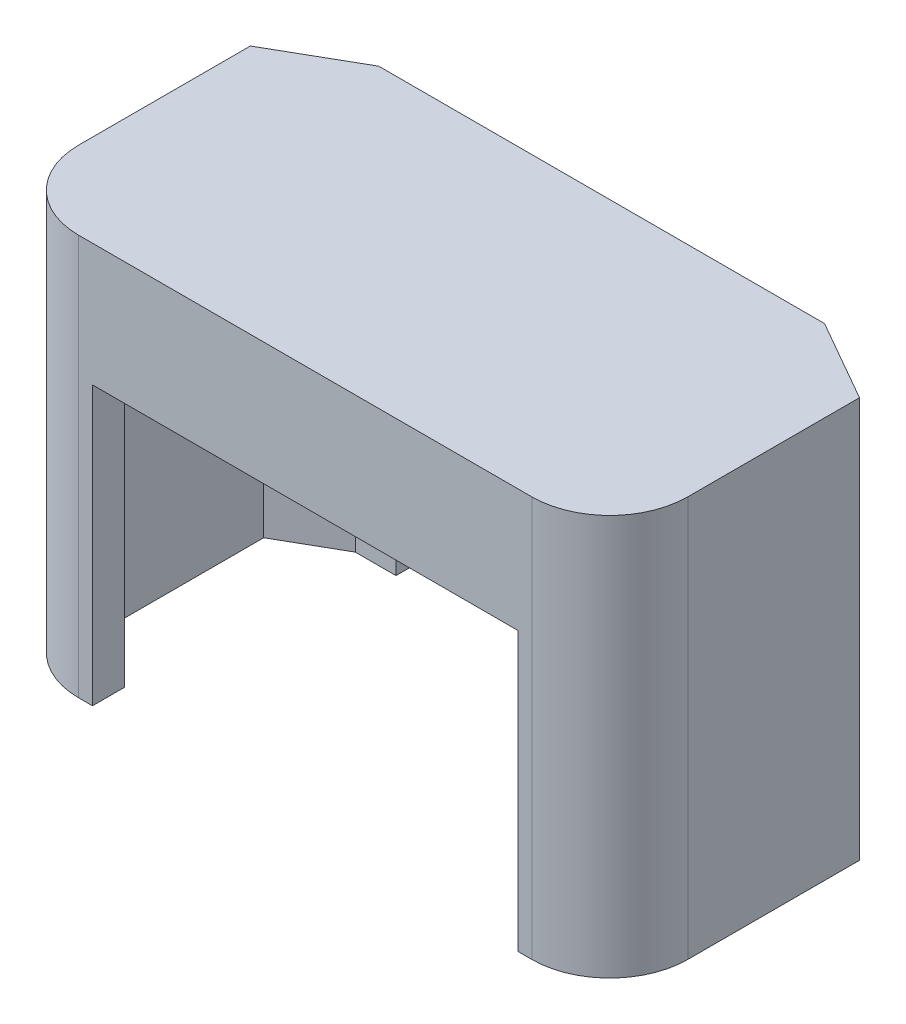
ISO-10303-21;
HEADER;
FILE_DESCRIPTION(('STEP AP214'),'2;1');
FILE_NAME('part.step','',(''),(''),'','','');
FILE_SCHEMA(('AUTOMOTIVE_DESIGN { 1 0 10303 214 1 1 1 1 }'));
ENDSEC;
DATA;
#1=APPLICATION_CONTEXT('core data for automotive mechanical design processes');
#2=APPLICATION_PROTOCOL_DEFINITION('international standard','automotive_design',2000,#1);
#3=PRODUCT_CONTEXT('',#1,'mechanical');
#4=PRODUCT('Part','Part','',(#3));
#5=PRODUCT_RELATED_PRODUCT_CATEGORY('part','',(#4));
#6=PRODUCT_DEFINITION_FORMATION('','',#4);
#7=PRODUCT_DEFINITION_CONTEXT('part definition',#1,'design');
#8=PRODUCT_DEFINITION('design','',#6,#7);
#9=PRODUCT_DEFINITION_SHAPE('','',#8);
#10=(LENGTH_UNIT() NAMED_UNIT(*) SI_UNIT(.MILLI.,.METRE.));
#11=(NAMED_UNIT(*) PLANE_ANGLE_UNIT() SI_UNIT($,.RADIAN.));
#12=(NAMED_UNIT(*) SI_UNIT($,.STERADIAN.) SOLID_ANGLE_UNIT());
#13=UNCERTAINTY_MEASURE_WITH_UNIT(LENGTH_MEASURE(1.E-05),#10,'distance_accuracy_value','');
#14=(GEOMETRIC_REPRESENTATION_CONTEXT(3) GLOBAL_UNCERTAINTY_ASSIGNED_CONTEXT((#13)) GLOBAL_UNIT_ASSIGNED_CONTEXT((#10,
#11,#12)) REPRESENTATION_CONTEXT('',''));
#15=CARTESIAN_POINT('',(0.,0.,0.));
#16=DIRECTION('',(0.,0.,1.));
#17=DIRECTION('',(1.,0.,0.));
#18=AXIS2_PLACEMENT_3D('',#15,#16,#17);
#19=CARTESIAN_POINT('',(-31.95,0.,9.9));
#20=DIRECTION('',(0.,-1.,0.));
#21=DIRECTION('',(0.,0.,-1.));
#22=AXIS2_PLACEMENT_3D('',#19,#20,#21);
#23=PLANE('',#22);
#24=DIRECTION('',(-1.,0.,0.));
#25=VECTOR('',#24,1.);
#26=CARTESIAN_POINT('',(-30.24,0.,-16.4));
#27=LINE('',#26,#25);
#28=CARTESIAN_POINT('',(30.24,0.,-16.4));
#29=VERTEX_POINT('',#28);
#30=CARTESIAN_POINT('',(24.5,0.,-16.4));
#31=VERTEX_POINT('',#30);
#32=EDGE_CURVE('E222',#29,#31,#27,.T.);
#33=ORIENTED_EDGE('',*,*,#32,.T.);
#34=DIRECTION('',(0.,0.,-1.));
#35=VECTOR('',#34,1.);
#36=CARTESIAN_POINT('',(24.5,0.,20.901));
#37=LINE('',#36,#35);
#38=CARTESIAN_POINT('',(24.5,0.,-20.9));
#39=VERTEX_POINT('',#38);
#40=EDGE_CURVE('E201',#31,#39,#37,.T.);
#41=ORIENTED_EDGE('',*,*,#40,.T.);
#42=DIRECTION('',(-1.,0.,0.));
#43=VECTOR('',#42,1.);
#44=CARTESIAN_POINT('',(-31.4369350222823,0.,-20.9));
#45=LINE('',#44,#43);
#46=CARTESIAN_POINT('',(31.4369350222823,0.,-20.9));
#47=VERTEX_POINT('',#46);
#48=EDGE_CURVE('E273',#47,#39,#45,.T.);
#49=ORIENTED_EDGE('',*,*,#48,.F.);
#50=DIRECTION('',(-0.867852571547069,0.,-0.496821813187725));
#51=VECTOR('',#50,1.);
#52=CARTESIAN_POINT('',(31.4369350222823,0.,-20.9));
#53=LINE('',#52,#51);
#54=CARTESIAN_POINT('',(42.95,0.,-14.3090858227438));
#55=VERTEX_POINT('',#54);
#56=EDGE_CURVE('E271',#55,#47,#53,.T.);
#57=ORIENTED_EDGE('',*,*,#56,.F.);
#58=DIRECTION('',(0.,0.,-1.));
#59=VECTOR('',#58,1.);
#60=CARTESIAN_POINT('',(42.95,0.,9.89999999999996));
#61=LINE('',#60,#59);
#62=CARTESIAN_POINT('',(42.95,0.,9.89999999999996));
#63=VERTEX_POINT('',#62);
#64=EDGE_CURVE('E267',#63,#55,#61,.T.);
#65=ORIENTED_EDGE('',*,*,#64,.F.);
#66=CARTESIAN_POINT('',(31.95,0.,9.9));
#67=DIRECTION('',(0.,1.,0.));
#68=DIRECTION('',(0.,0.,1.));
#69=AXIS2_PLACEMENT_3D('',#66,#67,#68);
#70=CIRCLE('',#69,11.);
#71=CARTESIAN_POINT('',(31.9499999999999,0.,20.9));
#72=VERTEX_POINT('',#71);
#73=EDGE_CURVE('E270',#72,#63,#70,.T.);
#74=ORIENTED_EDGE('',*,*,#73,.F.);
#75=DIRECTION('',(1.,0.,0.));
#76=VECTOR('',#75,1.);
#77=CARTESIAN_POINT('',(-31.95,0.,20.9));
#78=LINE('',#77,#76);
#79=CARTESIAN_POINT('',(30.,0.,20.9));
#80=VERTEX_POINT('',#79);
#81=EDGE_CURVE('E263',#80,#72,#78,.T.);
#82=ORIENTED_EDGE('',*,*,#81,.F.);
#83=DIRECTION('',(0.,0.,1.));
#84=VECTOR('',#83,1.);
#85=CARTESIAN_POINT('',(30.,0.,-20.901));
#86=LINE('',#85,#84);
#87=CARTESIAN_POINT('',(30.,0.,16.4));
#88=VERTEX_POINT('',#87);
#89=EDGE_CURVE('E424',#88,#80,#86,.T.);
#90=ORIENTED_EDGE('',*,*,#89,.F.);
#91=DIRECTION('',(1.,0.,0.));
#92=VECTOR('',#91,1.);
#93=CARTESIAN_POINT('',(-31.95,0.,16.4));
#94=LINE('',#93,#92);
#95=CARTESIAN_POINT('',(31.95,0.,16.4));
#96=VERTEX_POINT('',#95);
#97=EDGE_CURVE('E365',#88,#96,#94,.T.);
#98=ORIENTED_EDGE('',*,*,#97,.T.);
#99=CARTESIAN_POINT('',(31.95,0.,9.9));
#100=DIRECTION('',(0.,1.,0.));
#101=DIRECTION('',(0.,0.,1.));
#102=AXIS2_PLACEMENT_3D('',#99,#100,#101);
#103=CIRCLE('',#102,6.5);
#104=CARTESIAN_POINT('',(38.45,0.,9.89999999999996));
#105=VERTEX_POINT('',#104);
#106=EDGE_CURVE('E366',#96,#105,#103,.T.);
#107=ORIENTED_EDGE('',*,*,#106,.T.);
#108=DIRECTION('',(0.,0.,-1.));
#109=VECTOR('',#108,1.);
#110=CARTESIAN_POINT('',(38.45,0.,9.89999999999996));
#111=LINE('',#110,#109);
#112=CARTESIAN_POINT('',(38.45,0.,-11.7));
#113=VERTEX_POINT('',#112);
#114=EDGE_CURVE('E367',#105,#113,#111,.T.);
#115=ORIENTED_EDGE('',*,*,#114,.T.);
#116=DIRECTION('',(-0.867852571547069,0.,-0.496821813187725));
#117=VECTOR('',#116,1.);
#118=CARTESIAN_POINT('',(30.24,0.,-16.4));
#119=LINE('',#118,#117);
#120=EDGE_CURVE('E226',#113,#29,#119,.T.);
#121=ORIENTED_EDGE('',*,*,#120,.T.);
#122=EDGE_LOOP('',(#33,#41,#49,#57,#65,#74,#82,#90,#98,#107,#115,#121));
#123=FACE_BOUND('',#122,.T.);
#124=ADVANCED_FACE('F43',(#123),#23,.T.);
#125=CARTESIAN_POINT('',(-31.4369350222823,52.,-20.9));
#126=DIRECTION('',(0.,0.,1.));
#127=DIRECTION('',(1.,0.,0.));
#128=AXIS2_PLACEMENT_3D('',#125,#126,#127);
#129=PLANE('',#128);
#130=DIRECTION('',(0.,1.,0.));
#131=VECTOR('',#130,1.);
#132=CARTESIAN_POINT('',(-24.5,12.,-20.9));
#133=LINE('',#132,#131);
#134=CARTESIAN_POINT('',(-24.5,0.,-20.9));
#135=VERTEX_POINT('',#134);
#136=CARTESIAN_POINT('',(-24.5,12.,-20.9));
#137=VERTEX_POINT('',#136);
#138=EDGE_CURVE('E395',#135,#137,#133,.T.);
#139=ORIENTED_EDGE('',*,*,#138,.F.);
#140=CARTESIAN_POINT('',(-31.4369350222823,0.,-20.9));
#141=VERTEX_POINT('',#140);
#142=EDGE_CURVE('E272',#135,#141,#45,.T.);
#143=ORIENTED_EDGE('',*,*,#142,.T.);
#144=DIRECTION('',(0.,-1.,0.));
#145=VECTOR('',#144,1.);
#146=CARTESIAN_POINT('',(-31.4369350222823,52.,-20.9));
#147=LINE('',#146,#145);
#148=CARTESIAN_POINT('',(-31.4369350222823,56.5,-20.9));
#149=VERTEX_POINT('',#148);
#150=EDGE_CURVE('E288',#149,#141,#147,.T.);
#151=ORIENTED_EDGE('',*,*,#150,.F.);
#152=DIRECTION('',(-1.,0.,0.));
#153=VECTOR('',#152,1.);
#154=CARTESIAN_POINT('',(31.4369350222823,56.5,-20.9));
#155=LINE('',#154,#153);
#156=CARTESIAN_POINT('',(31.4369350222823,56.5,-20.9));
#157=VERTEX_POINT('',#156);
#158=EDGE_CURVE('E323',#157,#149,#155,.T.);
#159=ORIENTED_EDGE('',*,*,#158,.F.);
#160=DIRECTION('',(0.,-1.,0.));
#161=VECTOR('',#160,1.);
#162=CARTESIAN_POINT('',(31.4369350222823,52.,-20.9));
#163=LINE('',#162,#161);
#164=EDGE_CURVE('E290',#157,#47,#163,.T.);
#165=ORIENTED_EDGE('',*,*,#164,.T.);
#166=ORIENTED_EDGE('',*,*,#48,.T.);
#167=DIRECTION('',(0.,-1.,0.));
#168=VECTOR('',#167,1.);
#169=CARTESIAN_POINT('',(24.5,12.,-20.9));
#170=LINE('',#169,#168);
#171=CARTESIAN_POINT('',(24.5,12.,-20.9));
#172=VERTEX_POINT('',#171);
#173=EDGE_CURVE('E207',#172,#39,#170,.T.);
#174=ORIENTED_EDGE('',*,*,#173,.F.);
#175=DIRECTION('',(1.,0.,0.));
#176=VECTOR('',#175,1.);
#177=CARTESIAN_POINT('',(24.5,12.,-20.9));
#178=LINE('',#177,#176);
#179=EDGE_CURVE('E393',#137,#172,#178,.T.);
#180=ORIENTED_EDGE('',*,*,#179,.F.);
#181=EDGE_LOOP('',(#139,#143,#151,#159,#165,#166,#174,#180));
#182=FACE_BOUND('',#181,.T.);
#183=ADVANCED_FACE('F474',(#182),#129,.F.);
#184=CARTESIAN_POINT('',(-30.24,52.,-16.4));
#185=DIRECTION('',(0.,0.,1.));
#186=DIRECTION('',(1.,0.,0.));
#187=AXIS2_PLACEMENT_3D('',#184,#185,#186);
#188=PLANE('',#187);
#189=CARTESIAN_POINT('',(-24.5,0.,-16.4));
#190=VERTEX_POINT('',#189);
#191=CARTESIAN_POINT('',(-30.24,0.,-16.4));
#192=VERTEX_POINT('',#191);
#193=EDGE_CURVE('E233',#190,#192,#27,.T.);
#194=ORIENTED_EDGE('',*,*,#193,.F.);
#195=DIRECTION('',(0.,1.,0.));
#196=VECTOR('',#195,1.);
#197=CARTESIAN_POINT('',(-24.5,12.,-16.4));
#198=LINE('',#197,#196);
#199=CARTESIAN_POINT('',(-24.5,12.,-16.4));
#200=VERTEX_POINT('',#199);
#201=EDGE_CURVE('E223',#190,#200,#198,.T.);
#202=ORIENTED_EDGE('',*,*,#201,.T.);
#203=DIRECTION('',(1.,0.,0.));
#204=VECTOR('',#203,1.);
#205=CARTESIAN_POINT('',(24.5,12.,-16.4));
#206=LINE('',#205,#204);
#207=CARTESIAN_POINT('',(24.5,12.,-16.4));
#208=VERTEX_POINT('',#207);
#209=EDGE_CURVE('E221',#200,#208,#206,.T.);
#210=ORIENTED_EDGE('',*,*,#209,.T.);
#211=DIRECTION('',(0.,-1.,0.));
#212=VECTOR('',#211,1.);
#213=CARTESIAN_POINT('',(24.5,12.,-16.4));
#214=LINE('',#213,#212);
#215=EDGE_CURVE('E206',#208,#31,#214,.T.);
#216=ORIENTED_EDGE('',*,*,#215,.T.);
#217=ORIENTED_EDGE('',*,*,#32,.F.);
#218=DIRECTION('',(0.,-1.,0.));
#219=VECTOR('',#218,1.);
#220=CARTESIAN_POINT('',(30.24,52.,-16.4));
#221=LINE('',#220,#219);
#222=CARTESIAN_POINT('',(30.24,52.,-16.4));
#223=VERTEX_POINT('',#222);
#224=EDGE_CURVE('E248',#223,#29,#221,.T.);
#225=ORIENTED_EDGE('',*,*,#224,.F.);
#226=DIRECTION('',(-1.,0.,0.));
#227=VECTOR('',#226,1.);
#228=CARTESIAN_POINT('',(-30.24,52.,-16.4));
#229=LINE('',#228,#227);
#230=CARTESIAN_POINT('',(-30.24,52.,-16.4));
#231=VERTEX_POINT('',#230);
#232=EDGE_CURVE('E351',#223,#231,#229,.T.);
#233=ORIENTED_EDGE('',*,*,#232,.T.);
#234=DIRECTION('',(0.,-1.,0.));
#235=VECTOR('',#234,1.);
#236=CARTESIAN_POINT('',(-30.24,52.,-16.4));
#237=LINE('',#236,#235);
#238=EDGE_CURVE('E245',#231,#192,#237,.T.);
#239=ORIENTED_EDGE('',*,*,#238,.T.);
#240=EDGE_LOOP('',(#194,#202,#210,#216,#217,#225,#233,#239));
#241=FACE_BOUND('',#240,.T.);
#242=ADVANCED_FACE('F218',(#241),#188,.T.);
#243=DIRECTION('',(0.,0.,-1.));
#244=VECTOR('',#243,1.);
#245=CARTESIAN_POINT('',(-24.5,0.,20.901));
#246=LINE('',#245,#244);
#247=EDGE_CURVE('E212',#190,#135,#246,.T.);
#248=ORIENTED_EDGE('',*,*,#247,.F.);
#249=ORIENTED_EDGE('',*,*,#193,.T.);
#250=DIRECTION('',(-0.867852571547069,0.,0.496821813187725));
#251=VECTOR('',#250,1.);
#252=CARTESIAN_POINT('',(-38.45,0.,-11.7));
#253=LINE('',#252,#251);
#254=CARTESIAN_POINT('',(-38.45,0.,-11.7));
#255=VERTEX_POINT('',#254);
#256=EDGE_CURVE('E228',#192,#255,#253,.T.);
#257=ORIENTED_EDGE('',*,*,#256,.T.);
#258=DIRECTION('',(0.,0.,1.));
#259=VECTOR('',#258,1.);
#260=CARTESIAN_POINT('',(-38.45,0.,9.89999999999996));
#261=LINE('',#260,#259);
#262=CARTESIAN_POINT('',(-38.45,0.,9.89999999999996));
#263=VERTEX_POINT('',#262);
#264=EDGE_CURVE('E337',#255,#263,#261,.T.);
#265=ORIENTED_EDGE('',*,*,#264,.T.);
#266=CARTESIAN_POINT('',(-31.95,0.,9.9));
#267=DIRECTION('',(0.,1.,0.));
#268=DIRECTION('',(0.,0.,-1.));
#269=AXIS2_PLACEMENT_3D('',#266,#267,#268);
#270=CIRCLE('',#269,6.5);
#271=CARTESIAN_POINT('',(-31.95,0.,16.4));
#272=VERTEX_POINT('',#271);
#273=EDGE_CURVE('E363',#263,#272,#270,.T.);
#274=ORIENTED_EDGE('',*,*,#273,.T.);
#275=CARTESIAN_POINT('',(-30.,0.,16.4));
#276=VERTEX_POINT('',#275);
#277=EDGE_CURVE('E364',#272,#276,#94,.T.);
#278=ORIENTED_EDGE('',*,*,#277,.T.);
#279=DIRECTION('',(0.,0.,1.));
#280=VECTOR('',#279,1.);
#281=CARTESIAN_POINT('',(-30.,0.,-20.901));
#282=LINE('',#281,#280);
#283=CARTESIAN_POINT('',(-30.,0.,20.9));
#284=VERTEX_POINT('',#283);
#285=EDGE_CURVE('E406',#276,#284,#282,.T.);
#286=ORIENTED_EDGE('',*,*,#285,.T.);
#287=CARTESIAN_POINT('',(-31.95,0.,20.9));
#288=VERTEX_POINT('',#287);
#289=EDGE_CURVE('E262',#288,#284,#78,.T.);
#290=ORIENTED_EDGE('',*,*,#289,.F.);
#291=CARTESIAN_POINT('',(-31.95,0.,9.9));
#292=DIRECTION('',(0.,1.,0.));
#293=DIRECTION('',(0.,0.,-1.));
#294=AXIS2_PLACEMENT_3D('',#291,#292,#293);
#295=CIRCLE('',#294,11.);
#296=CARTESIAN_POINT('',(-42.95,0.,9.89999999999996));
#297=VERTEX_POINT('',#296);
#298=EDGE_CURVE('E257',#297,#288,#295,.T.);
#299=ORIENTED_EDGE('',*,*,#298,.F.);
#300=DIRECTION('',(0.,0.,1.));
#301=VECTOR('',#300,1.);
#302=CARTESIAN_POINT('',(-42.95,0.,9.89999999999996));
#303=LINE('',#302,#301);
#304=CARTESIAN_POINT('',(-42.95,0.,-14.3090858227438));
#305=VERTEX_POINT('',#304);
#306=EDGE_CURVE('E279',#305,#297,#303,.T.);
#307=ORIENTED_EDGE('',*,*,#306,.F.);
#308=DIRECTION('',(-0.867852571547069,0.,0.496821813187725));
#309=VECTOR('',#308,1.);
#310=CARTESIAN_POINT('',(-42.95,0.,-14.3090858227438));
#311=LINE('',#310,#309);
#312=EDGE_CURVE('E277',#141,#305,#311,.T.);
#313=ORIENTED_EDGE('',*,*,#312,.F.);
#314=ORIENTED_EDGE('',*,*,#142,.F.);
#315=EDGE_LOOP('',(#248,#249,#257,#265,#274,#278,#286,#290,#299,#307,#313,#314));
#316=FACE_BOUND('',#315,.T.);
#317=ADVANCED_FACE('F389',(#316),#23,.T.);
#318=CARTESIAN_POINT('',(-31.95,52.,20.9));
#319=DIRECTION('',(0.,0.,-1.));
#320=DIRECTION('',(-1.,0.,0.));
#321=AXIS2_PLACEMENT_3D('',#318,#319,#320);
#322=PLANE('',#321);
#323=DIRECTION('',(0.,1.,0.));
#324=VECTOR('',#323,1.);
#325=CARTESIAN_POINT('',(30.,39.2,20.9));
#326=LINE('',#325,#324);
#327=CARTESIAN_POINT('',(30.,39.2,20.9));
#328=VERTEX_POINT('',#327);
#329=EDGE_CURVE('E411',#80,#328,#326,.T.);
#330=ORIENTED_EDGE('',*,*,#329,.F.);
#331=ORIENTED_EDGE('',*,*,#81,.T.);
#332=DIRECTION('',(0.,-1.,0.));
#333=VECTOR('',#332,1.);
#334=CARTESIAN_POINT('',(31.9499999999999,52.,20.9));
#335=LINE('',#334,#333);
#336=CARTESIAN_POINT('',(31.9499999999999,56.5,20.9));
#337=VERTEX_POINT('',#336);
#338=EDGE_CURVE('E51',#337,#72,#335,.T.);
#339=ORIENTED_EDGE('',*,*,#338,.F.);
#340=DIRECTION('',(1.,0.,0.));
#341=VECTOR('',#340,1.);
#342=CARTESIAN_POINT('',(-31.95,56.5,20.9));
#343=LINE('',#342,#341);
#344=CARTESIAN_POINT('',(-31.95,56.5,20.9));
#345=VERTEX_POINT('',#344);
#346=EDGE_CURVE('E435',#345,#337,#343,.T.);
#347=ORIENTED_EDGE('',*,*,#346,.F.);
#348=DIRECTION('',(0.,-1.,0.));
#349=VECTOR('',#348,1.);
#350=CARTESIAN_POINT('',(-31.95,52.,20.9));
#351=LINE('',#350,#349);
#352=EDGE_CURVE('E11',#345,#288,#351,.T.);
#353=ORIENTED_EDGE('',*,*,#352,.T.);
#354=ORIENTED_EDGE('',*,*,#289,.T.);
#355=DIRECTION('',(0.,-1.,0.));
#356=VECTOR('',#355,1.);
#357=CARTESIAN_POINT('',(-30.,39.2,20.9));
#358=LINE('',#357,#356);
#359=CARTESIAN_POINT('',(-30.,39.2,20.9));
#360=VERTEX_POINT('',#359);
#361=EDGE_CURVE('E408',#360,#284,#358,.T.);
#362=ORIENTED_EDGE('',*,*,#361,.F.);
#363=DIRECTION('',(-1.,0.,0.));
#364=VECTOR('',#363,1.);
#365=CARTESIAN_POINT('',(-30.,39.2,20.9));
#366=LINE('',#365,#364);
#367=EDGE_CURVE('E412',#328,#360,#366,.T.);
#368=ORIENTED_EDGE('',*,*,#367,.F.);
#369=EDGE_LOOP('',(#330,#331,#339,#347,#353,#354,#362,#368));
#370=FACE_BOUND('',#369,.T.);
#371=ADVANCED_FACE('F436',(#370),#322,.F.);
#372=CARTESIAN_POINT('',(-31.95,52.,16.4));
#373=DIRECTION('',(0.,0.,-1.));
#374=DIRECTION('',(-1.,0.,0.));
#375=AXIS2_PLACEMENT_3D('',#372,#373,#374);
#376=PLANE('',#375);
#377=ORIENTED_EDGE('',*,*,#97,.F.);
#378=DIRECTION('',(0.,1.,0.));
#379=VECTOR('',#378,1.);
#380=CARTESIAN_POINT('',(30.,39.2,16.4));
#381=LINE('',#380,#379);
#382=CARTESIAN_POINT('',(30.,39.2,16.4));
#383=VERTEX_POINT('',#382);
#384=EDGE_CURVE('E403',#88,#383,#381,.T.);
#385=ORIENTED_EDGE('',*,*,#384,.T.);
#386=DIRECTION('',(-1.,0.,0.));
#387=VECTOR('',#386,1.);
#388=CARTESIAN_POINT('',(-30.,39.2,16.4));
#389=LINE('',#388,#387);
#390=CARTESIAN_POINT('',(-30.,39.2,16.4));
#391=VERTEX_POINT('',#390);
#392=EDGE_CURVE('E407',#383,#391,#389,.T.);
#393=ORIENTED_EDGE('',*,*,#392,.T.);
#394=DIRECTION('',(0.,-1.,0.));
#395=VECTOR('',#394,1.);
#396=CARTESIAN_POINT('',(-30.,39.2,16.4));
#397=LINE('',#396,#395);
#398=EDGE_CURVE('E423',#391,#276,#397,.T.);
#399=ORIENTED_EDGE('',*,*,#398,.T.);
#400=ORIENTED_EDGE('',*,*,#277,.F.);
#401=DIRECTION('',(0.,-1.,0.));
#402=VECTOR('',#401,1.);
#403=CARTESIAN_POINT('',(-31.95,52.,16.4));
#404=LINE('',#403,#402);
#405=CARTESIAN_POINT('',(-31.95,52.,16.4));
#406=VERTEX_POINT('',#405);
#407=EDGE_CURVE('E254',#406,#272,#404,.T.);
#408=ORIENTED_EDGE('',*,*,#407,.F.);
#409=DIRECTION('',(1.,0.,0.));
#410=VECTOR('',#409,1.);
#411=CARTESIAN_POINT('',(-31.95,52.,16.4));
#412=LINE('',#411,#410);
#413=CARTESIAN_POINT('',(31.95,52.,16.4));
#414=VERTEX_POINT('',#413);
#415=EDGE_CURVE('E344',#406,#414,#412,.T.);
#416=ORIENTED_EDGE('',*,*,#415,.T.);
#417=DIRECTION('',(0.,-1.,0.));
#418=VECTOR('',#417,1.);
#419=CARTESIAN_POINT('',(31.95,52.,16.4));
#420=LINE('',#419,#418);
#421=EDGE_CURVE('E252',#414,#96,#420,.T.);
#422=ORIENTED_EDGE('',*,*,#421,.T.);
#423=EDGE_LOOP('',(#377,#385,#393,#399,#400,#408,#416,#422));
#424=FACE_BOUND('',#423,.T.);
#425=ADVANCED_FACE('F450',(#424),#376,.T.);
#426=CARTESIAN_POINT('',(-31.95,52.,9.9));
#427=DIRECTION('',(0.,-1.,0.));
#428=DIRECTION('',(0.,0.,-1.));
#429=AXIS2_PLACEMENT_3D('',#426,#427,#428);
#430=CYLINDRICAL_SURFACE('',#429,11.);
#431=ORIENTED_EDGE('',*,*,#298,.T.);
#432=ORIENTED_EDGE('',*,*,#352,.F.);
#433=CARTESIAN_POINT('',(-31.95,56.5,9.9));
#434=DIRECTION('',(0.,1.,0.));
#435=DIRECTION('',(0.,0.,1.));
#436=AXIS2_PLACEMENT_3D('',#433,#434,#435);
#437=CIRCLE('',#436,11.);
#438=CARTESIAN_POINT('',(-42.95,56.5,9.89999999999996));
#439=VERTEX_POINT('',#438);
#440=EDGE_CURVE('E414',#439,#345,#437,.T.);
#441=ORIENTED_EDGE('',*,*,#440,.F.);
#442=DIRECTION('',(0.,-1.,0.));
#443=VECTOR('',#442,1.);
#444=CARTESIAN_POINT('',(-42.95,52.,9.89999999999996));
#445=LINE('',#444,#443);
#446=EDGE_CURVE('E278',#439,#297,#445,.T.);
#447=ORIENTED_EDGE('',*,*,#446,.T.);
#448=EDGE_LOOP('',(#431,#432,#441,#447));
#449=FACE_BOUND('',#448,.T.);
#450=ADVANCED_FACE('F44',(#449),#430,.T.);
#451=CARTESIAN_POINT('',(31.95,52.,9.9));
#452=DIRECTION('',(0.,-1.,0.));
#453=DIRECTION('',(0.,0.,-1.));
#454=AXIS2_PLACEMENT_3D('',#451,#452,#453);
#455=CYLINDRICAL_SURFACE('',#454,11.);
#456=ORIENTED_EDGE('',*,*,#73,.T.);
#457=DIRECTION('',(0.,-1.,0.));
#458=VECTOR('',#457,1.);
#459=CARTESIAN_POINT('',(42.95,52.,9.89999999999996));
#460=LINE('',#459,#458);
#461=CARTESIAN_POINT('',(42.95,56.5,9.9));
#462=VERTEX_POINT('',#461);
#463=EDGE_CURVE('E293',#462,#63,#460,.T.);
#464=ORIENTED_EDGE('',*,*,#463,.F.);
#465=CARTESIAN_POINT('',(31.95,56.5,9.9));
#466=DIRECTION('',(0.,1.,0.));
#467=DIRECTION('',(0.,0.,1.));
#468=AXIS2_PLACEMENT_3D('',#465,#466,#467);
#469=CIRCLE('',#468,11.);
#470=EDGE_CURVE('E302',#337,#462,#469,.T.);
#471=ORIENTED_EDGE('',*,*,#470,.F.);
#472=ORIENTED_EDGE('',*,*,#338,.T.);
#473=EDGE_LOOP('',(#456,#464,#471,#472));
#474=FACE_BOUND('',#473,.T.);
#475=ADVANCED_FACE('F303',(#474),#455,.T.);
#476=CARTESIAN_POINT('',(42.95,52.,9.89999999999996));
#477=DIRECTION('',(-1.,0.,0.));
#478=DIRECTION('',(0.,0.,1.));
#479=AXIS2_PLACEMENT_3D('',#476,#477,#478);
#480=PLANE('',#479);
#481=ORIENTED_EDGE('',*,*,#64,.T.);
#482=DIRECTION('',(0.,-1.,0.));
#483=VECTOR('',#482,1.);
#484=CARTESIAN_POINT('',(42.95,52.,-14.3090858227438));
#485=LINE('',#484,#483);
#486=CARTESIAN_POINT('',(42.95,56.5,-14.3090858227438));
#487=VERTEX_POINT('',#486);
#488=EDGE_CURVE('E295',#487,#55,#485,.T.);
#489=ORIENTED_EDGE('',*,*,#488,.F.);
#490=DIRECTION('',(0.,0.,-1.));
#491=VECTOR('',#490,1.);
#492=CARTESIAN_POINT('',(42.95,56.5,9.9));
#493=LINE('',#492,#491);
#494=EDGE_CURVE('E322',#462,#487,#493,.T.);
#495=ORIENTED_EDGE('',*,*,#494,.F.);
#496=ORIENTED_EDGE('',*,*,#463,.T.);
#497=EDGE_LOOP('',(#481,#489,#495,#496));
#498=FACE_BOUND('',#497,.T.);
#499=ADVANCED_FACE('F315',(#498),#480,.F.);
#500=CARTESIAN_POINT('',(31.4369350222823,52.,-20.9));
#501=DIRECTION('',(-0.496821813187725,0.,0.867852571547069));
#502=DIRECTION('',(0.867852571547069,0.,0.496821813187725));
#503=AXIS2_PLACEMENT_3D('',#500,#501,#502);
#504=PLANE('',#503);
#505=ORIENTED_EDGE('',*,*,#56,.T.);
#506=ORIENTED_EDGE('',*,*,#164,.F.);
#507=DIRECTION('',(-0.867852571547069,0.,-0.496821813187725));
#508=VECTOR('',#507,1.);
#509=CARTESIAN_POINT('',(42.95,56.5,-14.3090858227438));
#510=LINE('',#509,#508);
#511=EDGE_CURVE('E317',#487,#157,#510,.T.);
#512=ORIENTED_EDGE('',*,*,#511,.F.);
#513=ORIENTED_EDGE('',*,*,#488,.T.);
#514=EDGE_LOOP('',(#505,#506,#512,#513));
#515=FACE_BOUND('',#514,.T.);
#516=ADVANCED_FACE('F320',(#515),#504,.F.);
#517=CARTESIAN_POINT('',(-42.95,52.,-14.3090858227438));
#518=DIRECTION('',(0.496821813187725,0.,0.867852571547069));
#519=DIRECTION('',(0.867852571547069,0.,-0.496821813187725));
#520=AXIS2_PLACEMENT_3D('',#517,#518,#519);
#521=PLANE('',#520);
#522=ORIENTED_EDGE('',*,*,#312,.T.);
#523=DIRECTION('',(0.,-1.,0.));
#524=VECTOR('',#523,1.);
#525=CARTESIAN_POINT('',(-42.95,52.,-14.3090858227438));
#526=LINE('',#525,#524);
#527=CARTESIAN_POINT('',(-42.95,56.5,-14.3090858227438));
#528=VERTEX_POINT('',#527);
#529=EDGE_CURVE('E284',#528,#305,#526,.T.);
#530=ORIENTED_EDGE('',*,*,#529,.F.);
#531=DIRECTION('',(-0.867852571547069,0.,0.496821813187725));
#532=VECTOR('',#531,1.);
#533=CARTESIAN_POINT('',(-31.4369350222823,56.5,-20.9));
#534=LINE('',#533,#532);
#535=EDGE_CURVE('E326',#149,#528,#534,.T.);
#536=ORIENTED_EDGE('',*,*,#535,.F.);
#537=ORIENTED_EDGE('',*,*,#150,.T.);
#538=EDGE_LOOP('',(#522,#530,#536,#537));
#539=FACE_BOUND('',#538,.T.);
#540=ADVANCED_FACE('F466',(#539),#521,.F.);
#541=CARTESIAN_POINT('',(-42.95,52.,9.89999999999996));
#542=DIRECTION('',(1.,0.,0.));
#543=DIRECTION('',(0.,0.,-1.));
#544=AXIS2_PLACEMENT_3D('',#541,#542,#543);
#545=PLANE('',#544);
#546=ORIENTED_EDGE('',*,*,#306,.T.);
#547=ORIENTED_EDGE('',*,*,#446,.F.);
#548=DIRECTION('',(0.,0.,1.));
#549=VECTOR('',#548,1.);
#550=CARTESIAN_POINT('',(-42.95,56.5,-14.3090858227438));
#551=LINE('',#550,#549);
#552=EDGE_CURVE('E334',#528,#439,#551,.T.);
#553=ORIENTED_EDGE('',*,*,#552,.F.);
#554=ORIENTED_EDGE('',*,*,#529,.T.);
#555=EDGE_LOOP('',(#546,#547,#553,#554));
#556=FACE_BOUND('',#555,.T.);
#557=ADVANCED_FACE('F464',(#556),#545,.F.);
#558=CARTESIAN_POINT('',(-38.45,52.,9.89999999999996));
#559=DIRECTION('',(1.,0.,0.));
#560=DIRECTION('',(0.,0.,-1.));
#561=AXIS2_PLACEMENT_3D('',#558,#559,#560);
#562=PLANE('',#561);
#563=ORIENTED_EDGE('',*,*,#264,.F.);
#564=DIRECTION('',(0.,-1.,0.));
#565=VECTOR('',#564,1.);
#566=CARTESIAN_POINT('',(-38.45,52.,-11.7));
#567=LINE('',#566,#565);
#568=CARTESIAN_POINT('',(-38.45,52.,-11.7));
#569=VERTEX_POINT('',#568);
#570=EDGE_CURVE('E239',#569,#255,#567,.T.);
#571=ORIENTED_EDGE('',*,*,#570,.F.);
#572=DIRECTION('',(0.,0.,1.));
#573=VECTOR('',#572,1.);
#574=CARTESIAN_POINT('',(-38.45,52.,9.89999999999996));
#575=LINE('',#574,#573);
#576=CARTESIAN_POINT('',(-38.45,52.,9.89999999999996));
#577=VERTEX_POINT('',#576);
#578=EDGE_CURVE('E235',#569,#577,#575,.T.);
#579=ORIENTED_EDGE('',*,*,#578,.T.);
#580=DIRECTION('',(0.,-1.,0.));
#581=VECTOR('',#580,1.);
#582=CARTESIAN_POINT('',(-38.45,52.,9.89999999999996));
#583=LINE('',#582,#581);
#584=EDGE_CURVE('E260',#577,#263,#583,.T.);
#585=ORIENTED_EDGE('',*,*,#584,.T.);
#586=EDGE_LOOP('',(#563,#571,#579,#585));
#587=FACE_BOUND('',#586,.T.);
#588=ADVANCED_FACE('F462',(#587),#562,.T.);
#589=CARTESIAN_POINT('',(-31.95,52.,9.9));
#590=DIRECTION('',(0.,-1.,0.));
#591=DIRECTION('',(0.,0.,-1.));
#592=AXIS2_PLACEMENT_3D('',#589,#590,#591);
#593=CYLINDRICAL_SURFACE('',#592,6.5);
#594=ORIENTED_EDGE('',*,*,#273,.F.);
#595=ORIENTED_EDGE('',*,*,#584,.F.);
#596=CARTESIAN_POINT('',(-31.95,52.,9.9));
#597=DIRECTION('',(0.,1.,0.));
#598=DIRECTION('',(0.,0.,-1.));
#599=AXIS2_PLACEMENT_3D('',#596,#597,#598);
#600=CIRCLE('',#599,6.5);
#601=EDGE_CURVE('E336',#577,#406,#600,.T.);
#602=ORIENTED_EDGE('',*,*,#601,.T.);
#603=ORIENTED_EDGE('',*,*,#407,.T.);
#604=EDGE_LOOP('',(#594,#595,#602,#603));
#605=FACE_BOUND('',#604,.T.);
#606=ADVANCED_FACE('F459',(#605),#593,.F.);
#607=CARTESIAN_POINT('',(31.95,52.,9.9));
#608=DIRECTION('',(0.,-1.,0.));
#609=DIRECTION('',(0.,0.,-1.));
#610=AXIS2_PLACEMENT_3D('',#607,#608,#609);
#611=CYLINDRICAL_SURFACE('',#610,6.5);
#612=ORIENTED_EDGE('',*,*,#106,.F.);
#613=ORIENTED_EDGE('',*,*,#421,.F.);
#614=CARTESIAN_POINT('',(31.95,52.,9.9));
#615=DIRECTION('',(0.,1.,0.));
#616=DIRECTION('',(0.,0.,1.));
#617=AXIS2_PLACEMENT_3D('',#614,#615,#616);
#618=CIRCLE('',#617,6.5);
#619=CARTESIAN_POINT('',(38.45,52.,9.89999999999996));
#620=VERTEX_POINT('',#619);
#621=EDGE_CURVE('E341',#414,#620,#618,.T.);
#622=ORIENTED_EDGE('',*,*,#621,.T.);
#623=DIRECTION('',(0.,-1.,0.));
#624=VECTOR('',#623,1.);
#625=CARTESIAN_POINT('',(38.45,52.,9.89999999999996));
#626=LINE('',#625,#624);
#627=EDGE_CURVE('E246',#620,#105,#626,.T.);
#628=ORIENTED_EDGE('',*,*,#627,.T.);
#629=EDGE_LOOP('',(#612,#613,#622,#628));
#630=FACE_BOUND('',#629,.T.);
#631=ADVANCED_FACE('F457',(#630),#611,.F.);
#632=CARTESIAN_POINT('',(38.45,52.,9.89999999999996));
#633=DIRECTION('',(-1.,0.,0.));
#634=DIRECTION('',(0.,0.,1.));
#635=AXIS2_PLACEMENT_3D('',#632,#633,#634);
#636=PLANE('',#635);
#637=ORIENTED_EDGE('',*,*,#114,.F.);
#638=ORIENTED_EDGE('',*,*,#627,.F.);
#639=DIRECTION('',(0.,0.,-1.));
#640=VECTOR('',#639,1.);
#641=CARTESIAN_POINT('',(38.45,52.,9.89999999999996));
#642=LINE('',#641,#640);
#643=CARTESIAN_POINT('',(38.45,52.,-11.7));
#644=VERTEX_POINT('',#643);
#645=EDGE_CURVE('E346',#620,#644,#642,.T.);
#646=ORIENTED_EDGE('',*,*,#645,.T.);
#647=DIRECTION('',(0.,-1.,0.));
#648=VECTOR('',#647,1.);
#649=CARTESIAN_POINT('',(38.45,52.,-11.7));
#650=LINE('',#649,#648);
#651=EDGE_CURVE('E247',#644,#113,#650,.T.);
#652=ORIENTED_EDGE('',*,*,#651,.T.);
#653=EDGE_LOOP('',(#637,#638,#646,#652));
#654=FACE_BOUND('',#653,.T.);
#655=ADVANCED_FACE('F374',(#654),#636,.T.);
#656=CARTESIAN_POINT('',(30.24,52.,-16.4));
#657=DIRECTION('',(-0.496821813187725,0.,0.867852571547069));
#658=DIRECTION('',(0.867852571547069,0.,0.496821813187725));
#659=AXIS2_PLACEMENT_3D('',#656,#657,#658);
#660=PLANE('',#659);
#661=ORIENTED_EDGE('',*,*,#120,.F.);
#662=ORIENTED_EDGE('',*,*,#651,.F.);
#663=DIRECTION('',(-0.867852571547069,0.,-0.496821813187725));
#664=VECTOR('',#663,1.);
#665=CARTESIAN_POINT('',(30.24,52.,-16.4));
#666=LINE('',#665,#664);
#667=EDGE_CURVE('E352',#644,#223,#666,.T.);
#668=ORIENTED_EDGE('',*,*,#667,.T.);
#669=ORIENTED_EDGE('',*,*,#224,.T.);
#670=EDGE_LOOP('',(#661,#662,#668,#669));
#671=FACE_BOUND('',#670,.T.);
#672=ADVANCED_FACE('F378',(#671),#660,.T.);
#673=CARTESIAN_POINT('',(-38.45,52.,-11.7));
#674=DIRECTION('',(0.496821813187725,0.,0.867852571547069));
#675=DIRECTION('',(0.867852571547069,0.,-0.496821813187725));
#676=AXIS2_PLACEMENT_3D('',#673,#674,#675);
#677=PLANE('',#676);
#678=ORIENTED_EDGE('',*,*,#256,.F.);
#679=ORIENTED_EDGE('',*,*,#238,.F.);
#680=DIRECTION('',(-0.867852571547069,0.,0.496821813187725));
#681=VECTOR('',#680,1.);
#682=CARTESIAN_POINT('',(-38.45,52.,-11.7));
#683=LINE('',#682,#681);
#684=EDGE_CURVE('E244',#231,#569,#683,.T.);
#685=ORIENTED_EDGE('',*,*,#684,.T.);
#686=ORIENTED_EDGE('',*,*,#570,.T.);
#687=EDGE_LOOP('',(#678,#679,#685,#686));
#688=FACE_BOUND('',#687,.T.);
#689=ADVANCED_FACE('F384',(#688),#677,.T.);
#690=CARTESIAN_POINT('',(-31.95,52.,9.9));
#691=DIRECTION('',(0.,1.,0.));
#692=DIRECTION('',(0.,0.,1.));
#693=AXIS2_PLACEMENT_3D('',#690,#691,#692);
#694=PLANE('',#693);
#695=ORIENTED_EDGE('',*,*,#578,.F.);
#696=ORIENTED_EDGE('',*,*,#684,.F.);
#697=ORIENTED_EDGE('',*,*,#232,.F.);
#698=ORIENTED_EDGE('',*,*,#667,.F.);
#699=ORIENTED_EDGE('',*,*,#645,.F.);
#700=ORIENTED_EDGE('',*,*,#621,.F.);
#701=ORIENTED_EDGE('',*,*,#415,.F.);
#702=ORIENTED_EDGE('',*,*,#601,.F.);
#703=EDGE_LOOP('',(#695,#696,#697,#698,#699,#700,#701,#702));
#704=FACE_BOUND('',#703,.T.);
#705=ADVANCED_FACE('F385',(#704),#694,.F.);
#706=CARTESIAN_POINT('',(-31.95,56.5,9.9));
#707=DIRECTION('',(0.,1.,0.));
#708=DIRECTION('',(0.,0.,1.));
#709=AXIS2_PLACEMENT_3D('',#706,#707,#708);
#710=PLANE('',#709);
#711=ORIENTED_EDGE('',*,*,#440,.T.);
#712=ORIENTED_EDGE('',*,*,#346,.T.);
#713=ORIENTED_EDGE('',*,*,#470,.T.);
#714=ORIENTED_EDGE('',*,*,#494,.T.);
#715=ORIENTED_EDGE('',*,*,#511,.T.);
#716=ORIENTED_EDGE('',*,*,#158,.T.);
#717=ORIENTED_EDGE('',*,*,#535,.T.);
#718=ORIENTED_EDGE('',*,*,#552,.T.);
#719=EDGE_LOOP('',(#711,#712,#713,#714,#715,#716,#717,#718));
#720=FACE_BOUND('',#719,.T.);
#721=ADVANCED_FACE('F433',(#720),#710,.T.);
#722=CARTESIAN_POINT('',(30.,39.2,-20.901));
#723=DIRECTION('',(1.,0.,0.));
#724=DIRECTION('',(0.,1.,0.));
#725=AXIS2_PLACEMENT_3D('',#722,#723,#724);
#726=PLANE('',#725);
#727=ORIENTED_EDGE('',*,*,#89,.T.);
#728=ORIENTED_EDGE('',*,*,#329,.T.);
#729=DIRECTION('',(0.,0.,1.));
#730=VECTOR('',#729,1.);
#731=CARTESIAN_POINT('',(30.,39.2,-20.901));
#732=LINE('',#731,#730);
#733=EDGE_CURVE('E419',#383,#328,#732,.T.);
#734=ORIENTED_EDGE('',*,*,#733,.F.);
#735=ORIENTED_EDGE('',*,*,#384,.F.);
#736=EDGE_LOOP('',(#727,#728,#734,#735));
#737=FACE_BOUND('',#736,.T.);
#738=ADVANCED_FACE('F454',(#737),#726,.F.);
#739=CARTESIAN_POINT('',(-30.,39.2,-20.901));
#740=DIRECTION('',(-1.,0.,0.));
#741=DIRECTION('',(0.,-1.,0.));
#742=AXIS2_PLACEMENT_3D('',#739,#740,#741);
#743=PLANE('',#742);
#744=DIRECTION('',(0.,0.,1.));
#745=VECTOR('',#744,1.);
#746=CARTESIAN_POINT('',(-30.,39.2,-20.901));
#747=LINE('',#746,#745);
#748=EDGE_CURVE('E68',#391,#360,#747,.T.);
#749=ORIENTED_EDGE('',*,*,#748,.T.);
#750=ORIENTED_EDGE('',*,*,#361,.T.);
#751=ORIENTED_EDGE('',*,*,#285,.F.);
#752=ORIENTED_EDGE('',*,*,#398,.F.);
#753=EDGE_LOOP('',(#749,#750,#751,#752));
#754=FACE_BOUND('',#753,.T.);
#755=ADVANCED_FACE('F441',(#754),#743,.F.);
#756=CARTESIAN_POINT('',(-30.,39.2,-20.901));
#757=DIRECTION('',(0.,1.,0.));
#758=DIRECTION('',(0.,0.,1.));
#759=AXIS2_PLACEMENT_3D('',#756,#757,#758);
#760=PLANE('',#759);
#761=ORIENTED_EDGE('',*,*,#733,.T.);
#762=ORIENTED_EDGE('',*,*,#367,.T.);
#763=ORIENTED_EDGE('',*,*,#748,.F.);
#764=ORIENTED_EDGE('',*,*,#392,.F.);
#765=EDGE_LOOP('',(#761,#762,#763,#764));
#766=FACE_BOUND('',#765,.T.);
#767=ADVANCED_FACE('F448',(#766),#760,.F.);
#768=CARTESIAN_POINT('',(-24.5,12.,20.901));
#769=DIRECTION('',(-1.,0.,0.));
#770=DIRECTION('',(0.,-1.,0.));
#771=AXIS2_PLACEMENT_3D('',#768,#769,#770);
#772=PLANE('',#771);
#773=ORIENTED_EDGE('',*,*,#247,.T.);
#774=ORIENTED_EDGE('',*,*,#138,.T.);
#775=DIRECTION('',(0.,0.,-1.));
#776=VECTOR('',#775,1.);
#777=CARTESIAN_POINT('',(-24.5,12.,20.901));
#778=LINE('',#777,#776);
#779=EDGE_CURVE('E396',#200,#137,#778,.T.);
#780=ORIENTED_EDGE('',*,*,#779,.F.);
#781=ORIENTED_EDGE('',*,*,#201,.F.);
#782=EDGE_LOOP('',(#773,#774,#780,#781));
#783=FACE_BOUND('',#782,.T.);
#784=ADVANCED_FACE('F525',(#783),#772,.F.);
#785=CARTESIAN_POINT('',(24.5,12.,20.901));
#786=DIRECTION('',(1.,0.,0.));
#787=DIRECTION('',(0.,1.,0.));
#788=AXIS2_PLACEMENT_3D('',#785,#786,#787);
#789=PLANE('',#788);
#790=DIRECTION('',(0.,0.,-1.));
#791=VECTOR('',#790,1.);
#792=CARTESIAN_POINT('',(24.5,12.,20.901));
#793=LINE('',#792,#791);
#794=EDGE_CURVE('E59',#208,#172,#793,.T.);
#795=ORIENTED_EDGE('',*,*,#794,.T.);
#796=ORIENTED_EDGE('',*,*,#173,.T.);
#797=ORIENTED_EDGE('',*,*,#40,.F.);
#798=ORIENTED_EDGE('',*,*,#215,.F.);
#799=EDGE_LOOP('',(#795,#796,#797,#798));
#800=FACE_BOUND('',#799,.T.);
#801=ADVANCED_FACE('F202',(#800),#789,.F.);
#802=CARTESIAN_POINT('',(24.5,12.,20.901));
#803=DIRECTION('',(0.,1.,0.));
#804=DIRECTION('',(-1.,0.,0.));
#805=AXIS2_PLACEMENT_3D('',#802,#803,#804);
#806=PLANE('',#805);
#807=ORIENTED_EDGE('',*,*,#779,.T.);
#808=ORIENTED_EDGE('',*,*,#179,.T.);
#809=ORIENTED_EDGE('',*,*,#794,.F.);
#810=ORIENTED_EDGE('',*,*,#209,.F.);
#811=EDGE_LOOP('',(#807,#808,#809,#810));
#812=FACE_BOUND('',#811,.T.);
#813=ADVANCED_FACE('F521',(#812),#806,.F.);
#814=CLOSED_SHELL('',(#124,#183,#242,#317,#371,#425,#450,#475,#499,#516,#540,#557,#588,#606,
#631,#655,#672,#689,#705,#721,#738,#755,#767,#784,#801,#813));
#815=MANIFOLD_SOLID_BREP('B2',#814);
#816=ADVANCED_BREP_SHAPE_REPRESENTATION('',(#18,#815),#14);
#817=SHAPE_DEFINITION_REPRESENTATION(#9,#816);
ENDSEC;
END-ISO-10303-21;
